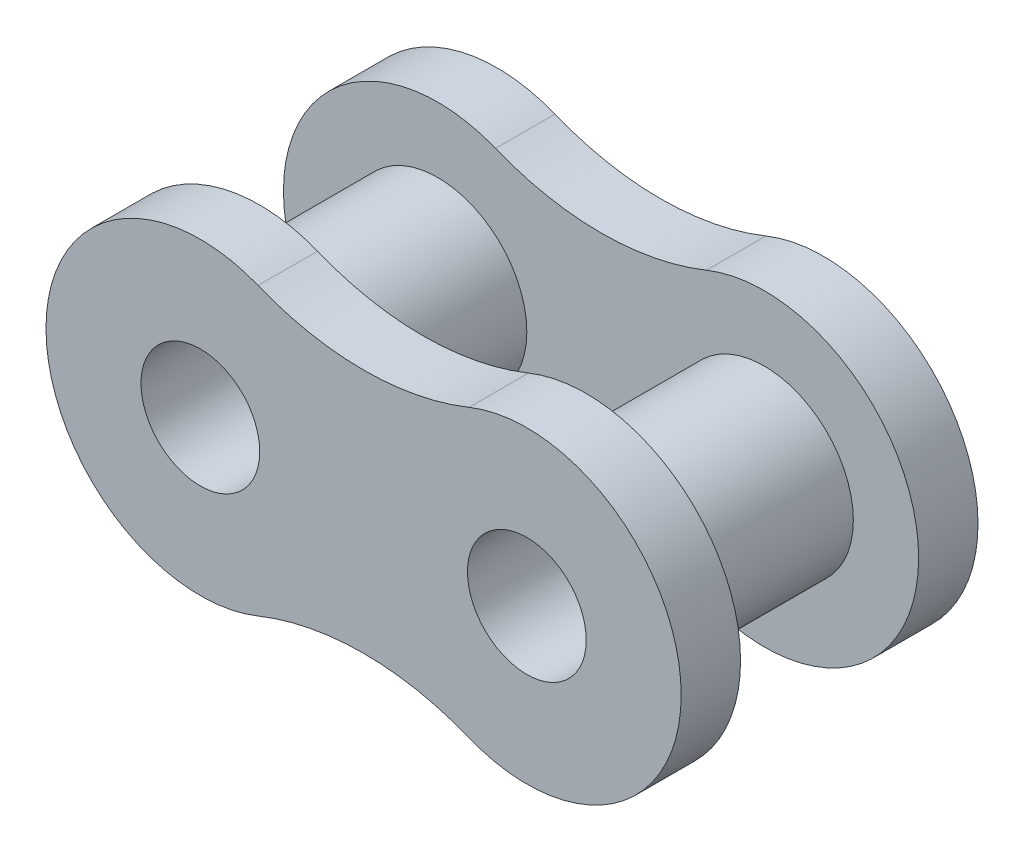
ISO-10303-21;
HEADER;
FILE_DESCRIPTION(('STEP AP214'),'2;1');
FILE_NAME('part.step','',(''),(''),'','','');
FILE_SCHEMA(('AUTOMOTIVE_DESIGN { 1 0 10303 214 1 1 1 1 }'));
ENDSEC;
DATA;
#1=APPLICATION_CONTEXT('core data for automotive mechanical design processes');
#2=APPLICATION_PROTOCOL_DEFINITION('international standard','automotive_design',2000,#1);
#3=PRODUCT_CONTEXT('',#1,'mechanical');
#4=PRODUCT('Part','Part','',(#3));
#5=PRODUCT_RELATED_PRODUCT_CATEGORY('part','',(#4));
#6=PRODUCT_DEFINITION_FORMATION('','',#4);
#7=PRODUCT_DEFINITION_CONTEXT('part definition',#1,'design');
#8=PRODUCT_DEFINITION('design','',#6,#7);
#9=PRODUCT_DEFINITION_SHAPE('','',#8);
#10=(LENGTH_UNIT() NAMED_UNIT(*) SI_UNIT(.MILLI.,.METRE.));
#11=(NAMED_UNIT(*) PLANE_ANGLE_UNIT() SI_UNIT($,.RADIAN.));
#12=(NAMED_UNIT(*) SI_UNIT($,.STERADIAN.) SOLID_ANGLE_UNIT());
#13=UNCERTAINTY_MEASURE_WITH_UNIT(LENGTH_MEASURE(1.E-05),#10,'distance_accuracy_value','');
#14=(GEOMETRIC_REPRESENTATION_CONTEXT(3) GLOBAL_UNCERTAINTY_ASSIGNED_CONTEXT((#13)) GLOBAL_UNIT_ASSIGNED_CONTEXT((#10,
#11,#12)) REPRESENTATION_CONTEXT('',''));
#15=CARTESIAN_POINT('',(0.,0.,0.));
#16=DIRECTION('',(0.,0.,1.));
#17=DIRECTION('',(1.,0.,0.));
#18=AXIS2_PLACEMENT_3D('',#15,#16,#17);
#19=CARTESIAN_POINT('',(-31.658849897573,-3.40807863759039,1.));
#20=DIRECTION('',(0.,0.,-1.));
#21=DIRECTION('',(-1.,0.,0.));
#22=AXIS2_PLACEMENT_3D('',#19,#20,#21);
#23=PLANE('',#22);
#24=CARTESIAN_POINT('',(-33.033849897573,-6.81615727518079,1.));
#25=DIRECTION('',(0.,0.,-1.));
#26=DIRECTION('',(-1.,0.,0.));
#27=AXIS2_PLACEMENT_3D('',#24,#25,#26);
#28=CIRCLE('',#27,4.75);
#29=CARTESIAN_POINT('',(-34.8110607819267,-2.41115767557416,1.));
#30=VERTEX_POINT('',#29);
#31=CARTESIAN_POINT('',(-31.2566390132193,-2.41115767557416,1.));
#32=VERTEX_POINT('',#31);
#33=EDGE_CURVE('E164',#30,#32,#28,.T.);
#34=ORIENTED_EDGE('',*,*,#33,.T.);
#35=CARTESIAN_POINT('',(-30.283849897573,0.,1.));
#36=DIRECTION('',(0.,0.,1.));
#37=DIRECTION('',(1.,0.,0.));
#38=AXIS2_PLACEMENT_3D('',#35,#36,#37);
#39=CIRCLE('',#38,2.6);
#40=CARTESIAN_POINT('',(-31.2566390132193,2.41115767557416,1.));
#41=VERTEX_POINT('',#40);
#42=EDGE_CURVE('E82',#32,#41,#39,.T.);
#43=ORIENTED_EDGE('',*,*,#42,.T.);
#44=CARTESIAN_POINT('',(-33.033849897573,6.81615727518079,1.));
#45=DIRECTION('',(0.,0.,-1.));
#46=DIRECTION('',(1.,0.,0.));
#47=AXIS2_PLACEMENT_3D('',#44,#45,#46);
#48=CIRCLE('',#47,4.75);
#49=CARTESIAN_POINT('',(-34.8110607819267,2.41115767557416,1.));
#50=VERTEX_POINT('',#49);
#51=EDGE_CURVE('E167',#41,#50,#48,.T.);
#52=ORIENTED_EDGE('',*,*,#51,.T.);
#53=CARTESIAN_POINT('',(-35.783849897573,0.,1.));
#54=DIRECTION('',(0.,0.,1.));
#55=DIRECTION('',(1.,0.,0.));
#56=AXIS2_PLACEMENT_3D('',#53,#54,#55);
#57=CIRCLE('',#56,2.6);
#58=EDGE_CURVE('E50',#50,#30,#57,.T.);
#59=ORIENTED_EDGE('',*,*,#58,.T.);
#60=EDGE_LOOP('',(#34,#43,#52,#59));
#61=FACE_BOUND('',#60,.T.);
#62=CARTESIAN_POINT('',(-30.283849897573,0.,1.));
#63=DIRECTION('',(0.,0.,1.));
#64=DIRECTION('',(1.,0.,0.));
#65=AXIS2_PLACEMENT_3D('',#62,#63,#64);
#66=CIRCLE('',#65,1.);
#67=CARTESIAN_POINT('',(-29.283849897573,0.,1.));
#68=VERTEX_POINT('',#67);
#69=EDGE_CURVE('E157',#68,#68,#66,.T.);
#70=ORIENTED_EDGE('',*,*,#69,.F.);
#71=EDGE_LOOP('',(#70));
#72=FACE_BOUND('',#71,.T.);
#73=CARTESIAN_POINT('',(-35.783849897573,0.,1.));
#74=DIRECTION('',(0.,0.,1.));
#75=DIRECTION('',(1.,0.,0.));
#76=AXIS2_PLACEMENT_3D('',#73,#74,#75);
#77=CIRCLE('',#76,0.999999999999998);
#78=CARTESIAN_POINT('',(-34.783849897573,0.,1.));
#79=VERTEX_POINT('',#78);
#80=EDGE_CURVE('E160',#79,#79,#77,.T.);
#81=ORIENTED_EDGE('',*,*,#80,.F.);
#82=EDGE_LOOP('',(#81));
#83=FACE_BOUND('',#82,.T.);
#84=ADVANCED_FACE('F32',(#61,#72,#83),#23,.F.);
#85=CARTESIAN_POINT('',(-31.658849897573,-3.40807863759039,0.));
#86=DIRECTION('',(0.,0.,-1.));
#87=DIRECTION('',(-1.,0.,0.));
#88=AXIS2_PLACEMENT_3D('',#85,#86,#87);
#89=PLANE('',#88);
#90=CARTESIAN_POINT('',(-35.783849897573,0.,0.));
#91=DIRECTION('',(0.,0.,-1.));
#92=DIRECTION('',(-1.,0.,0.));
#93=AXIS2_PLACEMENT_3D('',#90,#91,#92);
#94=CIRCLE('',#93,1.5);
#95=CARTESIAN_POINT('',(-37.283849897573,0.,0.));
#96=VERTEX_POINT('',#95);
#97=EDGE_CURVE('E11',#96,#96,#94,.T.);
#98=ORIENTED_EDGE('',*,*,#97,.F.);
#99=EDGE_LOOP('',(#98));
#100=FACE_BOUND('',#99,.T.);
#101=CARTESIAN_POINT('',(-30.283849897573,0.,0.));
#102=DIRECTION('',(0.,0.,-1.));
#103=DIRECTION('',(-1.,0.,0.));
#104=AXIS2_PLACEMENT_3D('',#101,#102,#103);
#105=CIRCLE('',#104,1.5);
#106=CARTESIAN_POINT('',(-31.783849897573,0.,0.));
#107=VERTEX_POINT('',#106);
#108=EDGE_CURVE('E184',#107,#107,#105,.T.);
#109=ORIENTED_EDGE('',*,*,#108,.F.);
#110=EDGE_LOOP('',(#109));
#111=FACE_BOUND('',#110,.T.);
#112=CARTESIAN_POINT('',(-33.033849897573,-6.81615727518079,0.));
#113=DIRECTION('',(0.,0.,-1.));
#114=DIRECTION('',(-1.,0.,0.));
#115=AXIS2_PLACEMENT_3D('',#112,#113,#114);
#116=CIRCLE('',#115,4.75);
#117=CARTESIAN_POINT('',(-34.8110607819267,-2.41115767557416,0.));
#118=VERTEX_POINT('',#117);
#119=CARTESIAN_POINT('',(-31.2566390132193,-2.41115767557416,0.));
#120=VERTEX_POINT('',#119);
#121=EDGE_CURVE('E163',#118,#120,#116,.T.);
#122=ORIENTED_EDGE('',*,*,#121,.F.);
#123=CARTESIAN_POINT('',(-35.783849897573,0.,0.));
#124=DIRECTION('',(0.,0.,1.));
#125=DIRECTION('',(1.,0.,0.));
#126=AXIS2_PLACEMENT_3D('',#123,#124,#125);
#127=CIRCLE('',#126,2.6);
#128=CARTESIAN_POINT('',(-34.8110607819267,2.41115767557416,0.));
#129=VERTEX_POINT('',#128);
#130=EDGE_CURVE('E74',#129,#118,#127,.T.);
#131=ORIENTED_EDGE('',*,*,#130,.F.);
#132=CARTESIAN_POINT('',(-33.033849897573,6.81615727518079,0.));
#133=DIRECTION('',(0.,0.,-1.));
#134=DIRECTION('',(1.,0.,0.));
#135=AXIS2_PLACEMENT_3D('',#132,#133,#134);
#136=CIRCLE('',#135,4.75);
#137=CARTESIAN_POINT('',(-31.2566390132193,2.41115767557416,0.));
#138=VERTEX_POINT('',#137);
#139=EDGE_CURVE('E68',#138,#129,#136,.T.);
#140=ORIENTED_EDGE('',*,*,#139,.F.);
#141=CARTESIAN_POINT('',(-30.283849897573,0.,0.));
#142=DIRECTION('',(0.,0.,1.));
#143=DIRECTION('',(1.,0.,0.));
#144=AXIS2_PLACEMENT_3D('',#141,#142,#143);
#145=CIRCLE('',#144,2.6);
#146=EDGE_CURVE('E173',#120,#138,#145,.T.);
#147=ORIENTED_EDGE('',*,*,#146,.F.);
#148=EDGE_LOOP('',(#122,#131,#140,#147));
#149=FACE_BOUND('',#148,.T.);
#150=ADVANCED_FACE('F214',(#100,#111,#149),#89,.T.);
#151=CARTESIAN_POINT('',(-33.033849897573,-6.81615727518079,1.));
#152=DIRECTION('',(0.,0.,-1.));
#153=DIRECTION('',(-1.,0.,0.));
#154=AXIS2_PLACEMENT_3D('',#151,#152,#153);
#155=CYLINDRICAL_SURFACE('',#154,4.75);
#156=ORIENTED_EDGE('',*,*,#121,.T.);
#157=DIRECTION('',(0.,0.,-1.));
#158=VECTOR('',#157,1.);
#159=CARTESIAN_POINT('',(-31.2566390132193,-2.41115767557416,1.));
#160=LINE('',#159,#158);
#161=EDGE_CURVE('E182',#32,#120,#160,.T.);
#162=ORIENTED_EDGE('',*,*,#161,.F.);
#163=ORIENTED_EDGE('',*,*,#33,.F.);
#164=DIRECTION('',(0.,0.,-1.));
#165=VECTOR('',#164,1.);
#166=CARTESIAN_POINT('',(-34.8110607819267,-2.41115767557416,1.));
#167=LINE('',#166,#165);
#168=EDGE_CURVE('E170',#30,#118,#167,.T.);
#169=ORIENTED_EDGE('',*,*,#168,.T.);
#170=EDGE_LOOP('',(#156,#162,#163,#169));
#171=FACE_BOUND('',#170,.T.);
#172=ADVANCED_FACE('F34',(#171),#155,.F.);
#173=CARTESIAN_POINT('',(-30.283849897573,0.,1.));
#174=DIRECTION('',(0.,0.,-1.));
#175=DIRECTION('',(-1.,0.,0.));
#176=AXIS2_PLACEMENT_3D('',#173,#174,#175);
#177=CYLINDRICAL_SURFACE('',#176,2.6);
#178=ORIENTED_EDGE('',*,*,#146,.T.);
#179=DIRECTION('',(0.,0.,-1.));
#180=VECTOR('',#179,1.);
#181=CARTESIAN_POINT('',(-31.2566390132193,2.41115767557416,1.));
#182=LINE('',#181,#180);
#183=EDGE_CURVE('E180',#41,#138,#182,.T.);
#184=ORIENTED_EDGE('',*,*,#183,.F.);
#185=ORIENTED_EDGE('',*,*,#42,.F.);
#186=ORIENTED_EDGE('',*,*,#161,.T.);
#187=EDGE_LOOP('',(#178,#184,#185,#186));
#188=FACE_BOUND('',#187,.T.);
#189=ADVANCED_FACE('F231',(#188),#177,.T.);
#190=CARTESIAN_POINT('',(-33.033849897573,6.81615727518079,1.));
#191=DIRECTION('',(0.,0.,-1.));
#192=DIRECTION('',(-1.,0.,0.));
#193=AXIS2_PLACEMENT_3D('',#190,#191,#192);
#194=CYLINDRICAL_SURFACE('',#193,4.75);
#195=ORIENTED_EDGE('',*,*,#139,.T.);
#196=DIRECTION('',(0.,0.,-1.));
#197=VECTOR('',#196,1.);
#198=CARTESIAN_POINT('',(-34.8110607819267,2.41115767557416,1.));
#199=LINE('',#198,#197);
#200=EDGE_CURVE('E178',#50,#129,#199,.T.);
#201=ORIENTED_EDGE('',*,*,#200,.F.);
#202=ORIENTED_EDGE('',*,*,#51,.F.);
#203=ORIENTED_EDGE('',*,*,#183,.T.);
#204=EDGE_LOOP('',(#195,#201,#202,#203));
#205=FACE_BOUND('',#204,.T.);
#206=ADVANCED_FACE('F229',(#205),#194,.F.);
#207=CARTESIAN_POINT('',(-35.783849897573,0.,1.));
#208=DIRECTION('',(0.,0.,-1.));
#209=DIRECTION('',(-1.,0.,0.));
#210=AXIS2_PLACEMENT_3D('',#207,#208,#209);
#211=CYLINDRICAL_SURFACE('',#210,2.6);
#212=ORIENTED_EDGE('',*,*,#130,.T.);
#213=ORIENTED_EDGE('',*,*,#168,.F.);
#214=ORIENTED_EDGE('',*,*,#58,.F.);
#215=ORIENTED_EDGE('',*,*,#200,.T.);
#216=EDGE_LOOP('',(#212,#213,#214,#215));
#217=FACE_BOUND('',#216,.T.);
#218=ADVANCED_FACE('F226',(#217),#211,.T.);
#219=CARTESIAN_POINT('',(-35.783849897573,0.,1.));
#220=DIRECTION('',(0.,0.,-1.));
#221=DIRECTION('',(-1.,0.,0.));
#222=AXIS2_PLACEMENT_3D('',#219,#220,#221);
#223=CYLINDRICAL_SURFACE('',#222,0.999999999999998);
#224=ORIENTED_EDGE('',*,*,#80,.T.);
#225=EDGE_LOOP('',(#224));
#226=FACE_BOUND('',#225,.T.);
#227=CARTESIAN_POINT('',(-35.783849897573,0.,-4.));
#228=DIRECTION('',(0.,0.,1.));
#229=DIRECTION('',(1.,0.,0.));
#230=AXIS2_PLACEMENT_3D('',#227,#228,#229);
#231=CIRCLE('',#230,0.999999999999998);
#232=CARTESIAN_POINT('',(-34.783849897573,0.,-4.));
#233=VERTEX_POINT('',#232);
#234=EDGE_CURVE('E141',#233,#233,#231,.T.);
#235=ORIENTED_EDGE('',*,*,#234,.F.);
#236=EDGE_LOOP('',(#235));
#237=FACE_BOUND('',#236,.T.);
#238=ADVANCED_FACE('F223',(#226,#237),#223,.F.);
#239=CARTESIAN_POINT('',(-30.283849897573,0.,1.));
#240=DIRECTION('',(0.,0.,-1.));
#241=DIRECTION('',(-1.,0.,0.));
#242=AXIS2_PLACEMENT_3D('',#239,#240,#241);
#243=CYLINDRICAL_SURFACE('',#242,1.);
#244=ORIENTED_EDGE('',*,*,#69,.T.);
#245=EDGE_LOOP('',(#244));
#246=FACE_BOUND('',#245,.T.);
#247=CARTESIAN_POINT('',(-30.283849897573,0.,-4.));
#248=DIRECTION('',(0.,0.,1.));
#249=DIRECTION('',(1.,0.,0.));
#250=AXIS2_PLACEMENT_3D('',#247,#248,#249);
#251=CIRCLE('',#250,1.);
#252=CARTESIAN_POINT('',(-29.283849897573,0.,-4.));
#253=VERTEX_POINT('',#252);
#254=EDGE_CURVE('E120',#253,#253,#251,.T.);
#255=ORIENTED_EDGE('',*,*,#254,.F.);
#256=EDGE_LOOP('',(#255));
#257=FACE_BOUND('',#256,.T.);
#258=ADVANCED_FACE('F260',(#246,#257),#243,.F.);
#259=CARTESIAN_POINT('',(-30.283849897573,0.,-4.));
#260=DIRECTION('',(0.,0.,1.));
#261=DIRECTION('',(1.,0.,0.));
#262=AXIS2_PLACEMENT_3D('',#259,#260,#261);
#263=CYLINDRICAL_SURFACE('',#262,1.5);
#264=CARTESIAN_POINT('',(-30.283849897573,0.,-3.));
#265=DIRECTION('',(0.,0.,1.));
#266=DIRECTION('',(1.,0.,0.));
#267=AXIS2_PLACEMENT_3D('',#264,#265,#266);
#268=CIRCLE('',#267,1.5);
#269=CARTESIAN_POINT('',(-28.783849897573,0.,-3.));
#270=VERTEX_POINT('',#269);
#271=EDGE_CURVE('E186',#270,#270,#268,.F.);
#272=ORIENTED_EDGE('',*,*,#271,.F.);
#273=EDGE_LOOP('',(#272));
#274=FACE_BOUND('',#273,.T.);
#275=ORIENTED_EDGE('',*,*,#108,.T.);
#276=EDGE_LOOP('',(#275));
#277=FACE_BOUND('',#276,.T.);
#278=ADVANCED_FACE('F270',(#274,#277),#263,.T.);
#279=CARTESIAN_POINT('',(-30.283849897573,0.,-4.));
#280=DIRECTION('',(0.,0.,1.));
#281=DIRECTION('',(1.,0.,0.));
#282=AXIS2_PLACEMENT_3D('',#279,#280,#281);
#283=PLANE('',#282);
#284=ORIENTED_EDGE('',*,*,#254,.T.);
#285=EDGE_LOOP('',(#284));
#286=FACE_BOUND('',#285,.T.);
#287=CARTESIAN_POINT('',(-33.033849897573,-6.81615727518079,-4.));
#288=DIRECTION('',(0.,0.,-1.));
#289=DIRECTION('',(-1.,0.,0.));
#290=AXIS2_PLACEMENT_3D('',#287,#288,#289);
#291=CIRCLE('',#290,4.75);
#292=CARTESIAN_POINT('',(-34.8110607819267,-2.41115767557416,-4.));
#293=VERTEX_POINT('',#292);
#294=CARTESIAN_POINT('',(-31.2566390132193,-2.41115767557416,-4.));
#295=VERTEX_POINT('',#294);
#296=EDGE_CURVE('E128',#293,#295,#291,.T.);
#297=ORIENTED_EDGE('',*,*,#296,.F.);
#298=CARTESIAN_POINT('',(-35.783849897573,0.,-4.));
#299=DIRECTION('',(0.,0.,1.));
#300=DIRECTION('',(1.,0.,0.));
#301=AXIS2_PLACEMENT_3D('',#298,#299,#300);
#302=CIRCLE('',#301,2.6);
#303=CARTESIAN_POINT('',(-34.8110607819267,2.41115767557416,-4.));
#304=VERTEX_POINT('',#303);
#305=EDGE_CURVE('E144',#304,#293,#302,.T.);
#306=ORIENTED_EDGE('',*,*,#305,.F.);
#307=CARTESIAN_POINT('',(-33.033849897573,6.81615727518079,-4.));
#308=DIRECTION('',(0.,0.,-1.));
#309=DIRECTION('',(1.,0.,0.));
#310=AXIS2_PLACEMENT_3D('',#307,#308,#309);
#311=CIRCLE('',#310,4.75);
#312=CARTESIAN_POINT('',(-31.2566390132193,2.41115767557416,-4.));
#313=VERTEX_POINT('',#312);
#314=EDGE_CURVE('E130',#313,#304,#311,.T.);
#315=ORIENTED_EDGE('',*,*,#314,.F.);
#316=CARTESIAN_POINT('',(-30.283849897573,0.,-4.));
#317=DIRECTION('',(0.,0.,1.));
#318=DIRECTION('',(1.,0.,0.));
#319=AXIS2_PLACEMENT_3D('',#316,#317,#318);
#320=CIRCLE('',#319,2.6);
#321=EDGE_CURVE('E112',#295,#313,#320,.T.);
#322=ORIENTED_EDGE('',*,*,#321,.F.);
#323=EDGE_LOOP('',(#297,#306,#315,#322));
#324=FACE_BOUND('',#323,.T.);
#325=ORIENTED_EDGE('',*,*,#234,.T.);
#326=EDGE_LOOP('',(#325));
#327=FACE_BOUND('',#326,.T.);
#328=ADVANCED_FACE('F125',(#286,#324,#327),#283,.F.);
#329=CARTESIAN_POINT('',(-31.658849897573,-3.40807863759039,-3.));
#330=DIRECTION('',(0.,0.,1.));
#331=DIRECTION('',(-1.,0.,0.));
#332=AXIS2_PLACEMENT_3D('',#329,#330,#331);
#333=PLANE('',#332);
#334=CARTESIAN_POINT('',(-35.783849897573,0.,-3.));
#335=DIRECTION('',(0.,0.,1.));
#336=DIRECTION('',(1.,0.,0.));
#337=AXIS2_PLACEMENT_3D('',#334,#335,#336);
#338=CIRCLE('',#337,1.5);
#339=CARTESIAN_POINT('',(-34.283849897573,0.,-3.));
#340=VERTEX_POINT('',#339);
#341=EDGE_CURVE('E36',#340,#340,#338,.T.);
#342=ORIENTED_EDGE('',*,*,#341,.F.);
#343=EDGE_LOOP('',(#342));
#344=FACE_BOUND('',#343,.T.);
#345=ORIENTED_EDGE('',*,*,#271,.T.);
#346=EDGE_LOOP('',(#345));
#347=FACE_BOUND('',#346,.T.);
#348=CARTESIAN_POINT('',(-33.033849897573,-6.81615727518079,-3.));
#349=DIRECTION('',(0.,0.,-1.));
#350=DIRECTION('',(-1.,0.,0.));
#351=AXIS2_PLACEMENT_3D('',#348,#349,#350);
#352=CIRCLE('',#351,4.75);
#353=CARTESIAN_POINT('',(-34.8110607819267,-2.41115767557416,-3.));
#354=VERTEX_POINT('',#353);
#355=CARTESIAN_POINT('',(-31.2566390132193,-2.41115767557416,-3.));
#356=VERTEX_POINT('',#355);
#357=EDGE_CURVE('E146',#354,#356,#352,.T.);
#358=ORIENTED_EDGE('',*,*,#357,.T.);
#359=CARTESIAN_POINT('',(-30.283849897573,0.,-3.));
#360=DIRECTION('',(0.,0.,1.));
#361=DIRECTION('',(1.,0.,0.));
#362=AXIS2_PLACEMENT_3D('',#359,#360,#361);
#363=CIRCLE('',#362,2.6);
#364=CARTESIAN_POINT('',(-31.2566390132193,2.41115767557416,-3.));
#365=VERTEX_POINT('',#364);
#366=EDGE_CURVE('E115',#356,#365,#363,.T.);
#367=ORIENTED_EDGE('',*,*,#366,.T.);
#368=CARTESIAN_POINT('',(-33.033849897573,6.81615727518079,-3.));
#369=DIRECTION('',(0.,0.,-1.));
#370=DIRECTION('',(1.,0.,0.));
#371=AXIS2_PLACEMENT_3D('',#368,#369,#370);
#372=CIRCLE('',#371,4.75);
#373=CARTESIAN_POINT('',(-34.8110607819267,2.41115767557416,-3.));
#374=VERTEX_POINT('',#373);
#375=EDGE_CURVE('E138',#365,#374,#372,.T.);
#376=ORIENTED_EDGE('',*,*,#375,.T.);
#377=CARTESIAN_POINT('',(-35.783849897573,0.,-3.));
#378=DIRECTION('',(0.,0.,1.));
#379=DIRECTION('',(1.,0.,0.));
#380=AXIS2_PLACEMENT_3D('',#377,#378,#379);
#381=CIRCLE('',#380,2.6);
#382=EDGE_CURVE('E135',#374,#354,#381,.T.);
#383=ORIENTED_EDGE('',*,*,#382,.T.);
#384=EDGE_LOOP('',(#358,#367,#376,#383));
#385=FACE_BOUND('',#384,.T.);
#386=ADVANCED_FACE('F195',(#344,#347,#385),#333,.T.);
#387=CARTESIAN_POINT('',(-33.033849897573,-6.81615727518079,-4.));
#388=DIRECTION('',(0.,0.,1.));
#389=DIRECTION('',(-1.,0.,0.));
#390=AXIS2_PLACEMENT_3D('',#387,#388,#389);
#391=CYLINDRICAL_SURFACE('',#390,4.75);
#392=ORIENTED_EDGE('',*,*,#357,.F.);
#393=DIRECTION('',(0.,0.,1.));
#394=VECTOR('',#393,1.);
#395=CARTESIAN_POINT('',(-34.8110607819267,-2.41115767557416,-4.));
#396=LINE('',#395,#394);
#397=EDGE_CURVE('E133',#293,#354,#396,.T.);
#398=ORIENTED_EDGE('',*,*,#397,.F.);
#399=ORIENTED_EDGE('',*,*,#296,.T.);
#400=DIRECTION('',(0.,0.,1.));
#401=VECTOR('',#400,1.);
#402=CARTESIAN_POINT('',(-31.2566390132193,-2.41115767557416,-4.));
#403=LINE('',#402,#401);
#404=EDGE_CURVE('E109',#295,#356,#403,.T.);
#405=ORIENTED_EDGE('',*,*,#404,.T.);
#406=EDGE_LOOP('',(#392,#398,#399,#405));
#407=FACE_BOUND('',#406,.T.);
#408=ADVANCED_FACE('F132',(#407),#391,.F.);
#409=CARTESIAN_POINT('',(-30.283849897573,0.,-4.));
#410=DIRECTION('',(0.,0.,1.));
#411=DIRECTION('',(-1.,0.,0.));
#412=AXIS2_PLACEMENT_3D('',#409,#410,#411);
#413=CYLINDRICAL_SURFACE('',#412,2.6);
#414=ORIENTED_EDGE('',*,*,#366,.F.);
#415=ORIENTED_EDGE('',*,*,#404,.F.);
#416=ORIENTED_EDGE('',*,*,#321,.T.);
#417=DIRECTION('',(0.,0.,1.));
#418=VECTOR('',#417,1.);
#419=CARTESIAN_POINT('',(-31.2566390132193,2.41115767557416,-4.));
#420=LINE('',#419,#418);
#421=EDGE_CURVE('E121',#313,#365,#420,.T.);
#422=ORIENTED_EDGE('',*,*,#421,.T.);
#423=EDGE_LOOP('',(#414,#415,#416,#422));
#424=FACE_BOUND('',#423,.T.);
#425=ADVANCED_FACE('F111',(#424),#413,.T.);
#426=CARTESIAN_POINT('',(-33.033849897573,6.81615727518079,-4.));
#427=DIRECTION('',(0.,0.,1.));
#428=DIRECTION('',(-1.,0.,0.));
#429=AXIS2_PLACEMENT_3D('',#426,#427,#428);
#430=CYLINDRICAL_SURFACE('',#429,4.75);
#431=ORIENTED_EDGE('',*,*,#375,.F.);
#432=ORIENTED_EDGE('',*,*,#421,.F.);
#433=ORIENTED_EDGE('',*,*,#314,.T.);
#434=DIRECTION('',(0.,0.,1.));
#435=VECTOR('',#434,1.);
#436=CARTESIAN_POINT('',(-34.8110607819267,2.41115767557416,-4.));
#437=LINE('',#436,#435);
#438=EDGE_CURVE('E152',#304,#374,#437,.T.);
#439=ORIENTED_EDGE('',*,*,#438,.T.);
#440=EDGE_LOOP('',(#431,#432,#433,#439));
#441=FACE_BOUND('',#440,.T.);
#442=ADVANCED_FACE('F204',(#441),#430,.F.);
#443=CARTESIAN_POINT('',(-35.783849897573,0.,-4.));
#444=DIRECTION('',(0.,0.,1.));
#445=DIRECTION('',(-1.,0.,0.));
#446=AXIS2_PLACEMENT_3D('',#443,#444,#445);
#447=CYLINDRICAL_SURFACE('',#446,2.6);
#448=ORIENTED_EDGE('',*,*,#382,.F.);
#449=ORIENTED_EDGE('',*,*,#438,.F.);
#450=ORIENTED_EDGE('',*,*,#305,.T.);
#451=ORIENTED_EDGE('',*,*,#397,.T.);
#452=EDGE_LOOP('',(#448,#449,#450,#451));
#453=FACE_BOUND('',#452,.T.);
#454=ADVANCED_FACE('F202',(#453),#447,.T.);
#455=CARTESIAN_POINT('',(-35.783849897573,0.,-4.));
#456=DIRECTION('',(0.,0.,1.));
#457=DIRECTION('',(1.,0.,0.));
#458=AXIS2_PLACEMENT_3D('',#455,#456,#457);
#459=CYLINDRICAL_SURFACE('',#458,1.5);
#460=ORIENTED_EDGE('',*,*,#97,.T.);
#461=EDGE_LOOP('',(#460));
#462=FACE_BOUND('',#461,.T.);
#463=ORIENTED_EDGE('',*,*,#341,.T.);
#464=EDGE_LOOP('',(#463));
#465=FACE_BOUND('',#464,.T.);
#466=ADVANCED_FACE('F193',(#462,#465),#459,.T.);
#467=CLOSED_SHELL('',(#84,#150,#172,#189,#206,#218,#238,#258,#278,#328,#386,#408,#425,#442,#454,#466));
#468=MANIFOLD_SOLID_BREP('B2',#467);
#469=ADVANCED_BREP_SHAPE_REPRESENTATION('',(#18,#468),#14);
#470=SHAPE_DEFINITION_REPRESENTATION(#9,#469);
ENDSEC;
END-ISO-10303-21;
